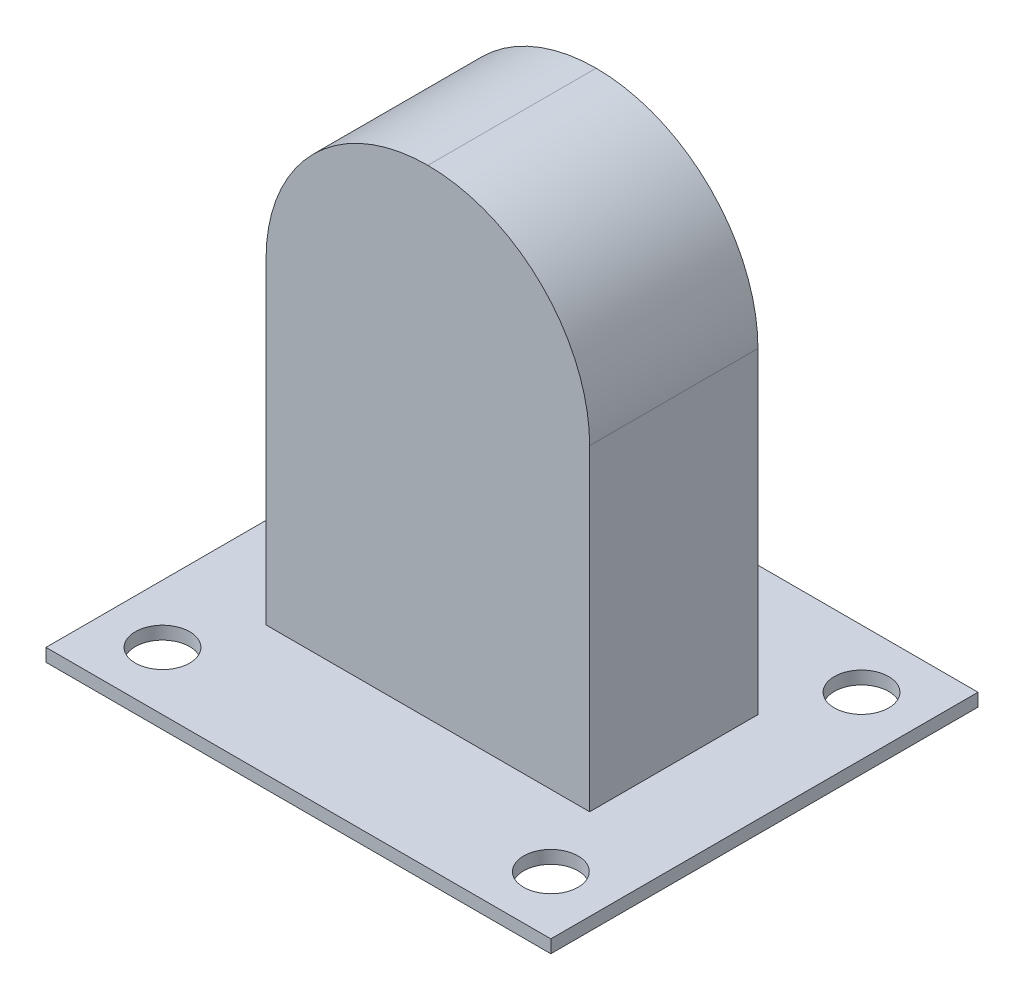
ISO-10303-21;
HEADER;
FILE_DESCRIPTION(('STEP AP214'),'2;1');
FILE_NAME('part.step','',(''),(''),'','','');
FILE_SCHEMA(('AUTOMOTIVE_DESIGN { 1 0 10303 214 1 1 1 1 }'));
ENDSEC;
DATA;
#1=APPLICATION_CONTEXT('core data for automotive mechanical design processes');
#2=APPLICATION_PROTOCOL_DEFINITION('international standard','automotive_design',2000,#1);
#3=PRODUCT_CONTEXT('',#1,'mechanical');
#4=PRODUCT('Part','Part','',(#3));
#5=PRODUCT_RELATED_PRODUCT_CATEGORY('part','',(#4));
#6=PRODUCT_DEFINITION_FORMATION('','',#4);
#7=PRODUCT_DEFINITION_CONTEXT('part definition',#1,'design');
#8=PRODUCT_DEFINITION('design','',#6,#7);
#9=PRODUCT_DEFINITION_SHAPE('','',#8);
#10=(LENGTH_UNIT() NAMED_UNIT(*) SI_UNIT(.MILLI.,.METRE.));
#11=(NAMED_UNIT(*) PLANE_ANGLE_UNIT() SI_UNIT($,.RADIAN.));
#12=(NAMED_UNIT(*) SI_UNIT($,.STERADIAN.) SOLID_ANGLE_UNIT());
#13=UNCERTAINTY_MEASURE_WITH_UNIT(LENGTH_MEASURE(1.E-05),#10,'distance_accuracy_value','');
#14=(GEOMETRIC_REPRESENTATION_CONTEXT(3) GLOBAL_UNCERTAINTY_ASSIGNED_CONTEXT((#13)) GLOBAL_UNIT_ASSIGNED_CONTEXT((#10,
#11,#12)) REPRESENTATION_CONTEXT('',''));
#15=CARTESIAN_POINT('',(0.,0.,0.));
#16=DIRECTION('',(0.,0.,1.));
#17=DIRECTION('',(1.,0.,0.));
#18=AXIS2_PLACEMENT_3D('',#15,#16,#17);
#19=CARTESIAN_POINT('',(0.,1.,0.));
#20=DIRECTION('',(0.,1.,0.));
#21=DIRECTION('',(0.,0.,1.));
#22=AXIS2_PLACEMENT_3D('',#19,#20,#21);
#23=PLANE('',#22);
#24=CARTESIAN_POINT('',(15.,1.,12.));
#25=DIRECTION('',(0.,1.,0.));
#26=DIRECTION('',(0.,0.,1.));
#27=AXIS2_PLACEMENT_3D('',#24,#25,#26);
#28=CIRCLE('',#27,2.10000000000001);
#29=CARTESIAN_POINT('',(15.,1.,14.1));
#30=VERTEX_POINT('',#29);
#31=EDGE_CURVE('E147',#30,#30,#28,.T.);
#32=ORIENTED_EDGE('',*,*,#31,.F.);
#33=EDGE_LOOP('',(#32));
#34=FACE_BOUND('',#33,.T.);
#35=CARTESIAN_POINT('',(-15.,1.,-12.));
#36=DIRECTION('',(0.,1.,0.));
#37=DIRECTION('',(0.,0.,1.));
#38=AXIS2_PLACEMENT_3D('',#35,#36,#37);
#39=CIRCLE('',#38,2.1);
#40=CARTESIAN_POINT('',(-15.,1.,-9.9));
#41=VERTEX_POINT('',#40);
#42=EDGE_CURVE('E159',#41,#41,#39,.T.);
#43=ORIENTED_EDGE('',*,*,#42,.F.);
#44=EDGE_LOOP('',(#43));
#45=FACE_BOUND('',#44,.T.);
#46=DIRECTION('',(0.,0.,-1.));
#47=VECTOR('',#46,1.);
#48=CARTESIAN_POINT('',(19.5,1.,-16.5));
#49=LINE('',#48,#47);
#50=CARTESIAN_POINT('',(19.5,1.,16.5));
#51=VERTEX_POINT('',#50);
#52=CARTESIAN_POINT('',(19.5,1.,-16.5));
#53=VERTEX_POINT('',#52);
#54=EDGE_CURVE('E165',#51,#53,#49,.T.);
#55=ORIENTED_EDGE('',*,*,#54,.T.);
#56=DIRECTION('',(-1.,0.,0.));
#57=VECTOR('',#56,1.);
#58=CARTESIAN_POINT('',(-19.5,1.,-16.5));
#59=LINE('',#58,#57);
#60=CARTESIAN_POINT('',(-19.5,1.,-16.5));
#61=VERTEX_POINT('',#60);
#62=EDGE_CURVE('E168',#53,#61,#59,.T.);
#63=ORIENTED_EDGE('',*,*,#62,.T.);
#64=DIRECTION('',(0.,0.,1.));
#65=VECTOR('',#64,1.);
#66=CARTESIAN_POINT('',(-19.5,1.,-16.5));
#67=LINE('',#66,#65);
#68=CARTESIAN_POINT('',(-19.5,1.,16.5));
#69=VERTEX_POINT('',#68);
#70=EDGE_CURVE('E171',#61,#69,#67,.T.);
#71=ORIENTED_EDGE('',*,*,#70,.T.);
#72=DIRECTION('',(1.,0.,0.));
#73=VECTOR('',#72,1.);
#74=CARTESIAN_POINT('',(-19.5,1.,16.5));
#75=LINE('',#74,#73);
#76=EDGE_CURVE('E173',#69,#51,#75,.T.);
#77=ORIENTED_EDGE('',*,*,#76,.T.);
#78=EDGE_LOOP('',(#55,#63,#71,#77));
#79=FACE_BOUND('',#78,.T.);
#80=CARTESIAN_POINT('',(15.,1.,-12.));
#81=DIRECTION('',(0.,1.,0.));
#82=DIRECTION('',(0.,0.,-1.));
#83=AXIS2_PLACEMENT_3D('',#80,#81,#82);
#84=CIRCLE('',#83,2.10000000000001);
#85=CARTESIAN_POINT('',(15.,1.,-14.1));
#86=VERTEX_POINT('',#85);
#87=EDGE_CURVE('E153',#86,#86,#84,.T.);
#88=ORIENTED_EDGE('',*,*,#87,.F.);
#89=EDGE_LOOP('',(#88));
#90=FACE_BOUND('',#89,.T.);
#91=CARTESIAN_POINT('',(-15.,1.,12.));
#92=DIRECTION('',(0.,1.,0.));
#93=DIRECTION('',(0.,0.,-1.));
#94=AXIS2_PLACEMENT_3D('',#91,#92,#93);
#95=CIRCLE('',#94,2.1);
#96=CARTESIAN_POINT('',(-15.,1.,9.90000000000001));
#97=VERTEX_POINT('',#96);
#98=EDGE_CURVE('E141',#97,#97,#95,.T.);
#99=ORIENTED_EDGE('',*,*,#98,.F.);
#100=EDGE_LOOP('',(#99));
#101=FACE_BOUND('',#100,.T.);
#102=DIRECTION('',(0.,0.,-1.));
#103=VECTOR('',#102,1.);
#104=CARTESIAN_POINT('',(-12.5,0.999999999999997,6.5));
#105=LINE('',#104,#103);
#106=CARTESIAN_POINT('',(-12.5,0.999999999999997,6.5));
#107=VERTEX_POINT('',#106);
#108=CARTESIAN_POINT('',(-12.5,0.999999999999997,-6.5));
#109=VERTEX_POINT('',#108);
#110=EDGE_CURVE('E121',#107,#109,#105,.T.);
#111=ORIENTED_EDGE('',*,*,#110,.T.);
#112=DIRECTION('',(1.,0.,0.));
#113=VECTOR('',#112,1.);
#114=CARTESIAN_POINT('',(-12.5,0.999999999999997,-6.5));
#115=LINE('',#114,#113);
#116=CARTESIAN_POINT('',(12.5,1.,-6.5));
#117=VERTEX_POINT('',#116);
#118=EDGE_CURVE('E137',#109,#117,#115,.T.);
#119=ORIENTED_EDGE('',*,*,#118,.T.);
#120=DIRECTION('',(0.,0.,-1.));
#121=VECTOR('',#120,1.);
#122=CARTESIAN_POINT('',(12.5,1.,6.5));
#123=LINE('',#122,#121);
#124=CARTESIAN_POINT('',(12.5,1.,6.5));
#125=VERTEX_POINT('',#124);
#126=EDGE_CURVE('E129',#125,#117,#123,.T.);
#127=ORIENTED_EDGE('',*,*,#126,.F.);
#128=DIRECTION('',(1.,0.,0.));
#129=VECTOR('',#128,1.);
#130=CARTESIAN_POINT('',(-12.5,0.999999999999997,6.5));
#131=LINE('',#130,#129);
#132=EDGE_CURVE('E113',#107,#125,#131,.T.);
#133=ORIENTED_EDGE('',*,*,#132,.F.);
#134=EDGE_LOOP('',(#111,#119,#127,#133));
#135=FACE_BOUND('',#134,.T.);
#136=ADVANCED_FACE('F39',(#34,#45,#79,#90,#101,#135),#23,.T.);
#137=CARTESIAN_POINT('',(0.,0.,0.));
#138=DIRECTION('',(0.,1.,0.));
#139=DIRECTION('',(0.,0.,1.));
#140=AXIS2_PLACEMENT_3D('',#137,#138,#139);
#141=PLANE('',#140);
#142=DIRECTION('',(0.,0.,-1.));
#143=VECTOR('',#142,1.);
#144=CARTESIAN_POINT('',(19.5,0.,-16.5));
#145=LINE('',#144,#143);
#146=CARTESIAN_POINT('',(19.5,0.,16.5));
#147=VERTEX_POINT('',#146);
#148=CARTESIAN_POINT('',(19.5,0.,-16.5));
#149=VERTEX_POINT('',#148);
#150=EDGE_CURVE('E162',#147,#149,#145,.T.);
#151=ORIENTED_EDGE('',*,*,#150,.F.);
#152=DIRECTION('',(1.,0.,0.));
#153=VECTOR('',#152,1.);
#154=CARTESIAN_POINT('',(-19.5,0.,16.5));
#155=LINE('',#154,#153);
#156=CARTESIAN_POINT('',(-19.5,0.,16.5));
#157=VERTEX_POINT('',#156);
#158=EDGE_CURVE('E169',#157,#147,#155,.T.);
#159=ORIENTED_EDGE('',*,*,#158,.F.);
#160=DIRECTION('',(0.,0.,1.));
#161=VECTOR('',#160,1.);
#162=CARTESIAN_POINT('',(-19.5,0.,-16.5));
#163=LINE('',#162,#161);
#164=CARTESIAN_POINT('',(-19.5,0.,-16.5));
#165=VERTEX_POINT('',#164);
#166=EDGE_CURVE('E180',#165,#157,#163,.T.);
#167=ORIENTED_EDGE('',*,*,#166,.F.);
#168=DIRECTION('',(-1.,0.,0.));
#169=VECTOR('',#168,1.);
#170=CARTESIAN_POINT('',(-19.5,0.,-16.5));
#171=LINE('',#170,#169);
#172=EDGE_CURVE('E178',#149,#165,#171,.T.);
#173=ORIENTED_EDGE('',*,*,#172,.F.);
#174=EDGE_LOOP('',(#151,#159,#167,#173));
#175=FACE_BOUND('',#174,.T.);
#176=CARTESIAN_POINT('',(-15.,0.,-12.));
#177=DIRECTION('',(0.,1.,0.));
#178=DIRECTION('',(0.,0.,1.));
#179=AXIS2_PLACEMENT_3D('',#176,#177,#178);
#180=CIRCLE('',#179,2.1);
#181=CARTESIAN_POINT('',(-15.,0.,-9.9));
#182=VERTEX_POINT('',#181);
#183=EDGE_CURVE('E156',#182,#182,#180,.T.);
#184=ORIENTED_EDGE('',*,*,#183,.T.);
#185=EDGE_LOOP('',(#184));
#186=FACE_BOUND('',#185,.T.);
#187=CARTESIAN_POINT('',(15.,0.,-12.));
#188=DIRECTION('',(0.,1.,0.));
#189=DIRECTION('',(0.,0.,-1.));
#190=AXIS2_PLACEMENT_3D('',#187,#188,#189);
#191=CIRCLE('',#190,2.10000000000001);
#192=CARTESIAN_POINT('',(15.,0.,-14.1));
#193=VERTEX_POINT('',#192);
#194=EDGE_CURVE('E150',#193,#193,#191,.T.);
#195=ORIENTED_EDGE('',*,*,#194,.T.);
#196=EDGE_LOOP('',(#195));
#197=FACE_BOUND('',#196,.T.);
#198=CARTESIAN_POINT('',(15.,0.,12.));
#199=DIRECTION('',(0.,1.,0.));
#200=DIRECTION('',(0.,0.,1.));
#201=AXIS2_PLACEMENT_3D('',#198,#199,#200);
#202=CIRCLE('',#201,2.10000000000001);
#203=CARTESIAN_POINT('',(15.,0.,14.1));
#204=VERTEX_POINT('',#203);
#205=EDGE_CURVE('E144',#204,#204,#202,.T.);
#206=ORIENTED_EDGE('',*,*,#205,.T.);
#207=EDGE_LOOP('',(#206));
#208=FACE_BOUND('',#207,.T.);
#209=CARTESIAN_POINT('',(-15.,0.,12.));
#210=DIRECTION('',(0.,1.,0.));
#211=DIRECTION('',(0.,0.,-1.));
#212=AXIS2_PLACEMENT_3D('',#209,#210,#211);
#213=CIRCLE('',#212,2.1);
#214=CARTESIAN_POINT('',(-15.,0.,9.90000000000001));
#215=VERTEX_POINT('',#214);
#216=EDGE_CURVE('E128',#215,#215,#213,.T.);
#217=ORIENTED_EDGE('',*,*,#216,.T.);
#218=EDGE_LOOP('',(#217));
#219=FACE_BOUND('',#218,.T.);
#220=ADVANCED_FACE('F215',(#175,#186,#197,#208,#219),#141,.F.);
#221=CARTESIAN_POINT('',(19.5,1.,-16.5));
#222=DIRECTION('',(-1.,0.,0.));
#223=DIRECTION('',(0.,0.,1.));
#224=AXIS2_PLACEMENT_3D('',#221,#222,#223);
#225=PLANE('',#224);
#226=ORIENTED_EDGE('',*,*,#150,.T.);
#227=DIRECTION('',(0.,-1.,0.));
#228=VECTOR('',#227,1.);
#229=CARTESIAN_POINT('',(19.5,1.,-16.5));
#230=LINE('',#229,#228);
#231=EDGE_CURVE('E191',#53,#149,#230,.T.);
#232=ORIENTED_EDGE('',*,*,#231,.F.);
#233=ORIENTED_EDGE('',*,*,#54,.F.);
#234=DIRECTION('',(0.,-1.,0.));
#235=VECTOR('',#234,1.);
#236=CARTESIAN_POINT('',(19.5,1.,16.5));
#237=LINE('',#236,#235);
#238=EDGE_CURVE('E175',#51,#147,#237,.T.);
#239=ORIENTED_EDGE('',*,*,#238,.T.);
#240=EDGE_LOOP('',(#226,#232,#233,#239));
#241=FACE_BOUND('',#240,.T.);
#242=ADVANCED_FACE('F223',(#241),#225,.F.);
#243=CARTESIAN_POINT('',(-19.5,1.,-16.5));
#244=DIRECTION('',(0.,0.,1.));
#245=DIRECTION('',(1.,0.,0.));
#246=AXIS2_PLACEMENT_3D('',#243,#244,#245);
#247=PLANE('',#246);
#248=ORIENTED_EDGE('',*,*,#172,.T.);
#249=DIRECTION('',(0.,-1.,0.));
#250=VECTOR('',#249,1.);
#251=CARTESIAN_POINT('',(-19.5,1.,-16.5));
#252=LINE('',#251,#250);
#253=EDGE_CURVE('E188',#61,#165,#252,.T.);
#254=ORIENTED_EDGE('',*,*,#253,.F.);
#255=ORIENTED_EDGE('',*,*,#62,.F.);
#256=ORIENTED_EDGE('',*,*,#231,.T.);
#257=EDGE_LOOP('',(#248,#254,#255,#256));
#258=FACE_BOUND('',#257,.T.);
#259=ADVANCED_FACE('F239',(#258),#247,.F.);
#260=CARTESIAN_POINT('',(-19.5,1.,-16.5));
#261=DIRECTION('',(1.,0.,0.));
#262=DIRECTION('',(0.,0.,-1.));
#263=AXIS2_PLACEMENT_3D('',#260,#261,#262);
#264=PLANE('',#263);
#265=ORIENTED_EDGE('',*,*,#166,.T.);
#266=DIRECTION('',(0.,-1.,0.));
#267=VECTOR('',#266,1.);
#268=CARTESIAN_POINT('',(-19.5,1.,16.5));
#269=LINE('',#268,#267);
#270=EDGE_CURVE('E185',#69,#157,#269,.T.);
#271=ORIENTED_EDGE('',*,*,#270,.F.);
#272=ORIENTED_EDGE('',*,*,#70,.F.);
#273=ORIENTED_EDGE('',*,*,#253,.T.);
#274=EDGE_LOOP('',(#265,#271,#272,#273));
#275=FACE_BOUND('',#274,.T.);
#276=ADVANCED_FACE('F235',(#275),#264,.F.);
#277=CARTESIAN_POINT('',(-19.5,1.,16.5));
#278=DIRECTION('',(0.,0.,-1.));
#279=DIRECTION('',(-1.,0.,0.));
#280=AXIS2_PLACEMENT_3D('',#277,#278,#279);
#281=PLANE('',#280);
#282=ORIENTED_EDGE('',*,*,#158,.T.);
#283=ORIENTED_EDGE('',*,*,#238,.F.);
#284=ORIENTED_EDGE('',*,*,#76,.F.);
#285=ORIENTED_EDGE('',*,*,#270,.T.);
#286=EDGE_LOOP('',(#282,#283,#284,#285));
#287=FACE_BOUND('',#286,.T.);
#288=ADVANCED_FACE('F232',(#287),#281,.F.);
#289=CARTESIAN_POINT('',(-15.,1.,-12.));
#290=DIRECTION('',(0.,-1.,0.));
#291=DIRECTION('',(0.,0.,-1.));
#292=AXIS2_PLACEMENT_3D('',#289,#290,#291);
#293=CYLINDRICAL_SURFACE('',#292,2.1);
#294=ORIENTED_EDGE('',*,*,#42,.T.);
#295=EDGE_LOOP('',(#294));
#296=FACE_BOUND('',#295,.T.);
#297=ORIENTED_EDGE('',*,*,#183,.F.);
#298=EDGE_LOOP('',(#297));
#299=FACE_BOUND('',#298,.T.);
#300=ADVANCED_FACE('F229',(#296,#299),#293,.F.);
#301=CARTESIAN_POINT('',(15.,1.,-12.));
#302=DIRECTION('',(0.,-1.,0.));
#303=DIRECTION('',(0.,0.,-1.));
#304=AXIS2_PLACEMENT_3D('',#301,#302,#303);
#305=CYLINDRICAL_SURFACE('',#304,2.10000000000001);
#306=ORIENTED_EDGE('',*,*,#87,.T.);
#307=EDGE_LOOP('',(#306));
#308=FACE_BOUND('',#307,.T.);
#309=ORIENTED_EDGE('',*,*,#194,.F.);
#310=EDGE_LOOP('',(#309));
#311=FACE_BOUND('',#310,.T.);
#312=ADVANCED_FACE('F275',(#308,#311),#305,.F.);
#313=CARTESIAN_POINT('',(15.,1.,12.));
#314=DIRECTION('',(0.,-1.,0.));
#315=DIRECTION('',(0.,0.,-1.));
#316=AXIS2_PLACEMENT_3D('',#313,#314,#315);
#317=CYLINDRICAL_SURFACE('',#316,2.10000000000001);
#318=ORIENTED_EDGE('',*,*,#31,.T.);
#319=EDGE_LOOP('',(#318));
#320=FACE_BOUND('',#319,.T.);
#321=ORIENTED_EDGE('',*,*,#205,.F.);
#322=EDGE_LOOP('',(#321));
#323=FACE_BOUND('',#322,.T.);
#324=ADVANCED_FACE('F266',(#320,#323),#317,.F.);
#325=CARTESIAN_POINT('',(-15.,1.,12.));
#326=DIRECTION('',(0.,-1.,0.));
#327=DIRECTION('',(0.,0.,-1.));
#328=AXIS2_PLACEMENT_3D('',#325,#326,#327);
#329=CYLINDRICAL_SURFACE('',#328,2.1);
#330=ORIENTED_EDGE('',*,*,#98,.T.);
#331=EDGE_LOOP('',(#330));
#332=FACE_BOUND('',#331,.T.);
#333=ORIENTED_EDGE('',*,*,#216,.F.);
#334=EDGE_LOOP('',(#333));
#335=FACE_BOUND('',#334,.T.);
#336=ADVANCED_FACE('F264',(#332,#335),#329,.F.);
#337=CARTESIAN_POINT('',(-12.5,0.999999999999997,6.5));
#338=DIRECTION('',(1.,0.,0.));
#339=DIRECTION('',(0.,1.,0.));
#340=AXIS2_PLACEMENT_3D('',#337,#338,#339);
#341=PLANE('',#340);
#342=DIRECTION('',(0.,-1.,0.));
#343=VECTOR('',#342,1.);
#344=CARTESIAN_POINT('',(-12.5,0.999999999999997,6.5));
#345=LINE('',#344,#343);
#346=CARTESIAN_POINT('',(-12.5,25.5,6.5));
#347=VERTEX_POINT('',#346);
#348=EDGE_CURVE('E109',#347,#107,#345,.T.);
#349=ORIENTED_EDGE('',*,*,#348,.F.);
#350=DIRECTION('',(0.,0.,-1.));
#351=VECTOR('',#350,1.);
#352=CARTESIAN_POINT('',(-12.5,25.5,6.5));
#353=LINE('',#352,#351);
#354=CARTESIAN_POINT('',(-12.5,25.5,-6.5));
#355=VERTEX_POINT('',#354);
#356=EDGE_CURVE('E194',#347,#355,#353,.T.);
#357=ORIENTED_EDGE('',*,*,#356,.T.);
#358=DIRECTION('',(0.,-1.,0.));
#359=VECTOR('',#358,1.);
#360=CARTESIAN_POINT('',(-12.5,0.999999999999997,-6.5));
#361=LINE('',#360,#359);
#362=EDGE_CURVE('E124',#355,#109,#361,.T.);
#363=ORIENTED_EDGE('',*,*,#362,.T.);
#364=ORIENTED_EDGE('',*,*,#110,.F.);
#365=EDGE_LOOP('',(#349,#357,#363,#364));
#366=FACE_BOUND('',#365,.T.);
#367=ADVANCED_FACE('F122',(#366),#341,.F.);
#368=CARTESIAN_POINT('',(12.5,1.,6.5));
#369=DIRECTION('',(-1.,0.,0.));
#370=DIRECTION('',(0.,-1.,0.));
#371=AXIS2_PLACEMENT_3D('',#368,#369,#370);
#372=PLANE('',#371);
#373=DIRECTION('',(0.,1.,0.));
#374=VECTOR('',#373,1.);
#375=CARTESIAN_POINT('',(12.5,1.,-6.5));
#376=LINE('',#375,#374);
#377=CARTESIAN_POINT('',(12.5,25.5,-6.5));
#378=VERTEX_POINT('',#377);
#379=EDGE_CURVE('E118',#117,#378,#376,.T.);
#380=ORIENTED_EDGE('',*,*,#379,.T.);
#381=DIRECTION('',(0.,0.,-1.));
#382=VECTOR('',#381,1.);
#383=CARTESIAN_POINT('',(12.5,25.5,6.5));
#384=LINE('',#383,#382);
#385=CARTESIAN_POINT('',(12.5,25.5,6.5));
#386=VERTEX_POINT('',#385);
#387=EDGE_CURVE('E11',#378,#386,#384,.F.);
#388=ORIENTED_EDGE('',*,*,#387,.T.);
#389=DIRECTION('',(0.,1.,0.));
#390=VECTOR('',#389,1.);
#391=CARTESIAN_POINT('',(12.5,1.,6.5));
#392=LINE('',#391,#390);
#393=EDGE_CURVE('E132',#125,#386,#392,.T.);
#394=ORIENTED_EDGE('',*,*,#393,.F.);
#395=ORIENTED_EDGE('',*,*,#126,.T.);
#396=EDGE_LOOP('',(#380,#388,#394,#395));
#397=FACE_BOUND('',#396,.T.);
#398=ADVANCED_FACE('F273',(#397),#372,.F.);
#399=CARTESIAN_POINT('',(0.,0.,6.5));
#400=DIRECTION('',(0.,0.,-1.));
#401=DIRECTION('',(-1.,0.,0.));
#402=AXIS2_PLACEMENT_3D('',#399,#400,#401);
#403=PLANE('',#402);
#404=CARTESIAN_POINT('',(0.,25.5,6.5));
#405=DIRECTION('',(0.,0.,-1.));
#406=DIRECTION('',(-1.,0.,0.));
#407=AXIS2_PLACEMENT_3D('',#404,#405,#406);
#408=CIRCLE('',#407,12.5);
#409=CARTESIAN_POINT('',(0.,38.,6.5));
#410=VERTEX_POINT('',#409);
#411=EDGE_CURVE('E55',#386,#410,#408,.F.);
#412=ORIENTED_EDGE('',*,*,#411,.T.);
#413=CARTESIAN_POINT('',(0.,25.5,6.5));
#414=DIRECTION('',(0.,0.,-1.));
#415=DIRECTION('',(-1.,0.,0.));
#416=AXIS2_PLACEMENT_3D('',#413,#414,#415);
#417=CIRCLE('',#416,12.5);
#418=EDGE_CURVE('E48',#410,#347,#417,.F.);
#419=ORIENTED_EDGE('',*,*,#418,.T.);
#420=ORIENTED_EDGE('',*,*,#348,.T.);
#421=ORIENTED_EDGE('',*,*,#132,.T.);
#422=ORIENTED_EDGE('',*,*,#393,.T.);
#423=EDGE_LOOP('',(#412,#419,#420,#421,#422));
#424=FACE_BOUND('',#423,.T.);
#425=ADVANCED_FACE('F111',(#424),#403,.F.);
#426=CARTESIAN_POINT('',(0.,0.,-6.5));
#427=DIRECTION('',(0.,0.,-1.));
#428=DIRECTION('',(-1.,0.,0.));
#429=AXIS2_PLACEMENT_3D('',#426,#427,#428);
#430=PLANE('',#429);
#431=ORIENTED_EDGE('',*,*,#362,.F.);
#432=CARTESIAN_POINT('',(0.,25.5,-6.5));
#433=DIRECTION('',(0.,0.,-1.));
#434=DIRECTION('',(-1.,0.,0.));
#435=AXIS2_PLACEMENT_3D('',#432,#433,#434);
#436=CIRCLE('',#435,12.5);
#437=CARTESIAN_POINT('',(0.,38.,-6.5));
#438=VERTEX_POINT('',#437);
#439=EDGE_CURVE('E198',#355,#438,#436,.T.);
#440=ORIENTED_EDGE('',*,*,#439,.T.);
#441=CARTESIAN_POINT('',(0.,25.5,-6.5));
#442=DIRECTION('',(0.,0.,-1.));
#443=DIRECTION('',(-1.,0.,0.));
#444=AXIS2_PLACEMENT_3D('',#441,#442,#443);
#445=CIRCLE('',#444,12.5);
#446=EDGE_CURVE('E196',#438,#378,#445,.T.);
#447=ORIENTED_EDGE('',*,*,#446,.T.);
#448=ORIENTED_EDGE('',*,*,#379,.F.);
#449=ORIENTED_EDGE('',*,*,#118,.F.);
#450=EDGE_LOOP('',(#431,#440,#447,#448,#449));
#451=FACE_BOUND('',#450,.T.);
#452=ADVANCED_FACE('F203',(#451),#430,.T.);
#453=CARTESIAN_POINT('',(0.,25.5,6.5));
#454=DIRECTION('',(0.,0.,-1.));
#455=DIRECTION('',(-1.,0.,0.));
#456=AXIS2_PLACEMENT_3D('',#453,#454,#455);
#457=CYLINDRICAL_SURFACE('',#456,12.5);
#458=DIRECTION('',(0.,0.,-1.));
#459=VECTOR('',#458,1.);
#460=CARTESIAN_POINT('',(0.,38.,6.5));
#461=LINE('',#460,#459);
#462=EDGE_CURVE('E43',#410,#438,#461,.T.);
#463=ORIENTED_EDGE('',*,*,#462,.F.);
#464=ORIENTED_EDGE('',*,*,#411,.F.);
#465=ORIENTED_EDGE('',*,*,#387,.F.);
#466=ORIENTED_EDGE('',*,*,#446,.F.);
#467=EDGE_LOOP('',(#463,#464,#465,#466));
#468=FACE_BOUND('',#467,.T.);
#469=ADVANCED_FACE('F41',(#468),#457,.T.);
#470=CARTESIAN_POINT('',(0.,25.5,6.5));
#471=DIRECTION('',(0.,0.,-1.));
#472=DIRECTION('',(-1.,0.,0.));
#473=AXIS2_PLACEMENT_3D('',#470,#471,#472);
#474=CYLINDRICAL_SURFACE('',#473,12.5);
#475=ORIENTED_EDGE('',*,*,#418,.F.);
#476=ORIENTED_EDGE('',*,*,#462,.T.);
#477=ORIENTED_EDGE('',*,*,#439,.F.);
#478=ORIENTED_EDGE('',*,*,#356,.F.);
#479=EDGE_LOOP('',(#475,#476,#477,#478));
#480=FACE_BOUND('',#479,.T.);
#481=ADVANCED_FACE('F208',(#480),#474,.T.);
#482=CLOSED_SHELL('',(#136,#220,#242,#259,#276,#288,#300,#312,#324,#336,#367,#398,#425,#452,
#469,#481));
#483=MANIFOLD_SOLID_BREP('B2',#482);
#484=ADVANCED_BREP_SHAPE_REPRESENTATION('',(#18,#483),#14);
#485=SHAPE_DEFINITION_REPRESENTATION(#9,#484);
ENDSEC;
END-ISO-10303-21;
